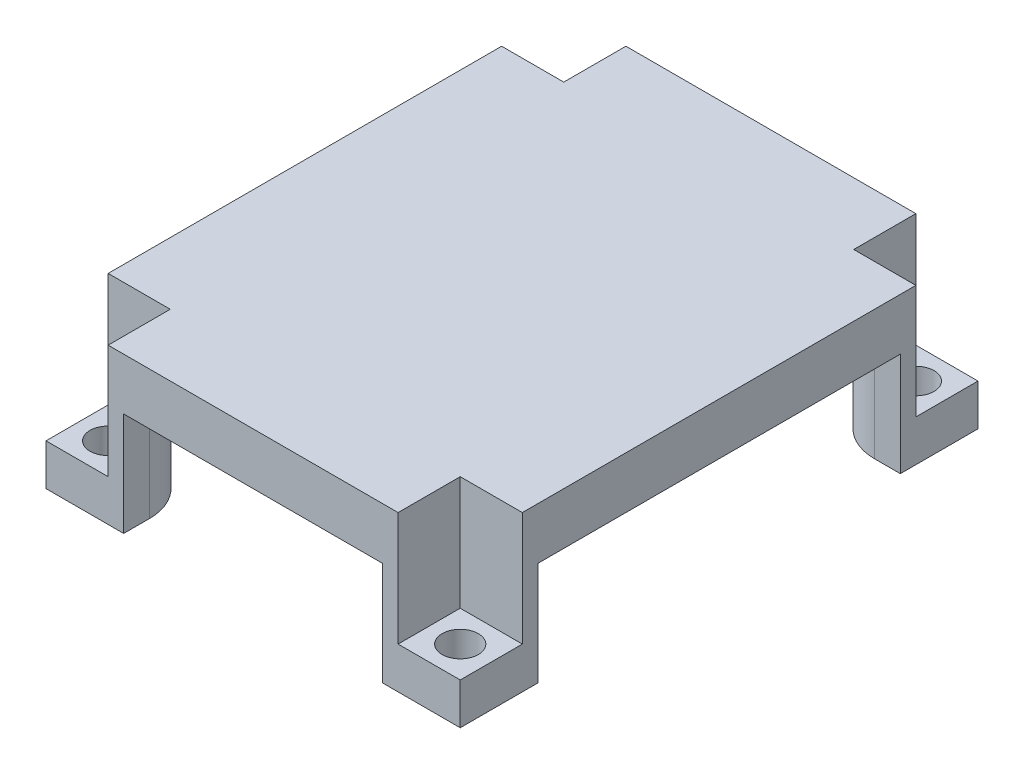
ISO-10303-21;
HEADER;
FILE_DESCRIPTION(('STEP AP214'),'2;1');
FILE_NAME('part.step','',(''),(''),'','','');
FILE_SCHEMA(('AUTOMOTIVE_DESIGN { 1 0 10303 214 1 1 1 1 }'));
ENDSEC;
DATA;
#1=APPLICATION_CONTEXT('core data for automotive mechanical design processes');
#2=APPLICATION_PROTOCOL_DEFINITION('international standard','automotive_design',2000,#1);
#3=PRODUCT_CONTEXT('',#1,'mechanical');
#4=PRODUCT('Part','Part','',(#3));
#5=PRODUCT_RELATED_PRODUCT_CATEGORY('part','',(#4));
#6=PRODUCT_DEFINITION_FORMATION('','',#4);
#7=PRODUCT_DEFINITION_CONTEXT('part definition',#1,'design');
#8=PRODUCT_DEFINITION('design','',#6,#7);
#9=PRODUCT_DEFINITION_SHAPE('','',#8);
#10=(LENGTH_UNIT() NAMED_UNIT(*) SI_UNIT(.MILLI.,.METRE.));
#11=(NAMED_UNIT(*) PLANE_ANGLE_UNIT() SI_UNIT($,.RADIAN.));
#12=(NAMED_UNIT(*) SI_UNIT($,.STERADIAN.) SOLID_ANGLE_UNIT());
#13=UNCERTAINTY_MEASURE_WITH_UNIT(LENGTH_MEASURE(1.E-05),#10,'distance_accuracy_value','');
#14=(GEOMETRIC_REPRESENTATION_CONTEXT(3) GLOBAL_UNCERTAINTY_ASSIGNED_CONTEXT((#13)) GLOBAL_UNIT_ASSIGNED_CONTEXT((#10,
#11,#12)) REPRESENTATION_CONTEXT('',''));
#15=CARTESIAN_POINT('',(0.,0.,0.));
#16=DIRECTION('',(0.,0.,1.));
#17=DIRECTION('',(1.,0.,0.));
#18=AXIS2_PLACEMENT_3D('',#15,#16,#17);
#19=CARTESIAN_POINT('',(0.,0.,0.));
#20=DIRECTION('',(0.,-1.,0.));
#21=DIRECTION('',(0.,0.,-1.));
#22=AXIS2_PLACEMENT_3D('',#19,#20,#21);
#23=PLANE('',#22);
#24=DIRECTION('',(0.,0.,1.));
#25=VECTOR('',#24,1.);
#26=CARTESIAN_POINT('',(-12.5,0.,-25.));
#27=LINE('',#26,#25);
#28=CARTESIAN_POINT('',(-12.5,0.,-25.));
#29=VERTEX_POINT('',#28);
#30=CARTESIAN_POINT('',(-12.5,0.,-22.5));
#31=VERTEX_POINT('',#30);
#32=EDGE_CURVE('E238',#29,#31,#27,.T.);
#33=ORIENTED_EDGE('',*,*,#32,.T.);
#34=CARTESIAN_POINT('',(-17.5,0.,-22.5));
#35=DIRECTION('',(0.,-1.,0.));
#36=DIRECTION('',(0.,0.,-1.));
#37=AXIS2_PLACEMENT_3D('',#34,#35,#36);
#38=CIRCLE('',#37,5.);
#39=CARTESIAN_POINT('',(-17.5,0.,-17.5));
#40=VERTEX_POINT('',#39);
#41=EDGE_CURVE('E337',#31,#40,#38,.T.);
#42=ORIENTED_EDGE('',*,*,#41,.T.);
#43=DIRECTION('',(-1.,0.,0.));
#44=VECTOR('',#43,1.);
#45=CARTESIAN_POINT('',(20.,0.,-17.5));
#46=LINE('',#45,#44);
#47=CARTESIAN_POINT('',(-20.,0.,-17.5));
#48=VERTEX_POINT('',#47);
#49=EDGE_CURVE('E392',#40,#48,#46,.T.);
#50=ORIENTED_EDGE('',*,*,#49,.T.);
#51=DIRECTION('',(0.,0.,1.));
#52=VECTOR('',#51,1.);
#53=CARTESIAN_POINT('',(-20.,0.,25.));
#54=LINE('',#53,#52);
#55=CARTESIAN_POINT('',(-20.,0.,-25.));
#56=VERTEX_POINT('',#55);
#57=EDGE_CURVE('E263',#56,#48,#54,.T.);
#58=ORIENTED_EDGE('',*,*,#57,.F.);
#59=DIRECTION('',(-1.,0.,0.));
#60=VECTOR('',#59,1.);
#61=CARTESIAN_POINT('',(-20.,0.,-25.));
#62=LINE('',#61,#60);
#63=EDGE_CURVE('E252',#29,#56,#62,.T.);
#64=ORIENTED_EDGE('',*,*,#63,.F.);
#65=EDGE_LOOP('',(#33,#42,#50,#58,#64));
#66=FACE_BOUND('',#65,.T.);
#67=CARTESIAN_POINT('',(-17.,0.,-22.));
#68=DIRECTION('',(0.,1.,0.));
#69=DIRECTION('',(0.,0.,1.));
#70=AXIS2_PLACEMENT_3D('',#67,#68,#69);
#71=CIRCLE('',#70,1.75);
#72=CARTESIAN_POINT('',(-17.,0.,-20.25));
#73=VERTEX_POINT('',#72);
#74=EDGE_CURVE('E502',#73,#73,#71,.T.);
#75=ORIENTED_EDGE('',*,*,#74,.T.);
#76=EDGE_LOOP('',(#75));
#77=FACE_BOUND('',#76,.T.);
#78=ADVANCED_FACE('F33',(#66,#77),#23,.T.);
#79=DIRECTION('',(-1.,0.,0.));
#80=VECTOR('',#79,1.);
#81=CARTESIAN_POINT('',(20.,0.,17.5));
#82=LINE('',#81,#80);
#83=CARTESIAN_POINT('',(-17.5,0.,17.5));
#84=VERTEX_POINT('',#83);
#85=CARTESIAN_POINT('',(-20.,0.,17.5));
#86=VERTEX_POINT('',#85);
#87=EDGE_CURVE('E372',#84,#86,#82,.T.);
#88=ORIENTED_EDGE('',*,*,#87,.F.);
#89=CARTESIAN_POINT('',(-17.5,0.,22.5));
#90=DIRECTION('',(0.,-1.,0.));
#91=DIRECTION('',(0.,0.,-1.));
#92=AXIS2_PLACEMENT_3D('',#89,#90,#91);
#93=CIRCLE('',#92,5.);
#94=CARTESIAN_POINT('',(-12.5,0.,22.5));
#95=VERTEX_POINT('',#94);
#96=EDGE_CURVE('E329',#84,#95,#93,.T.);
#97=ORIENTED_EDGE('',*,*,#96,.T.);
#98=CARTESIAN_POINT('',(-12.5,0.,25.));
#99=VERTEX_POINT('',#98);
#100=EDGE_CURVE('E247',#95,#99,#27,.T.);
#101=ORIENTED_EDGE('',*,*,#100,.T.);
#102=DIRECTION('',(1.,0.,0.));
#103=VECTOR('',#102,1.);
#104=CARTESIAN_POINT('',(-20.,0.,25.));
#105=LINE('',#104,#103);
#106=CARTESIAN_POINT('',(-20.,0.,25.));
#107=VERTEX_POINT('',#106);
#108=EDGE_CURVE('E276',#107,#99,#105,.T.);
#109=ORIENTED_EDGE('',*,*,#108,.F.);
#110=EDGE_CURVE('E268',#86,#107,#54,.T.);
#111=ORIENTED_EDGE('',*,*,#110,.F.);
#112=EDGE_LOOP('',(#88,#97,#101,#109,#111));
#113=FACE_BOUND('',#112,.T.);
#114=CARTESIAN_POINT('',(-17.,0.,22.));
#115=DIRECTION('',(0.,-1.,0.));
#116=DIRECTION('',(0.,0.,-1.));
#117=AXIS2_PLACEMENT_3D('',#114,#115,#116);
#118=CIRCLE('',#117,1.75);
#119=CARTESIAN_POINT('',(-17.,0.,20.25));
#120=VERTEX_POINT('',#119);
#121=EDGE_CURVE('E296',#120,#120,#118,.T.);
#122=ORIENTED_EDGE('',*,*,#121,.F.);
#123=EDGE_LOOP('',(#122));
#124=FACE_BOUND('',#123,.T.);
#125=ADVANCED_FACE('F367',(#113,#124),#23,.T.);
#126=CARTESIAN_POINT('',(20.,0.,-17.5));
#127=DIRECTION('',(0.,0.,-1.));
#128=DIRECTION('',(0.,1.,0.));
#129=AXIS2_PLACEMENT_3D('',#126,#127,#128);
#130=PLANE('',#129);
#131=ORIENTED_EDGE('',*,*,#49,.F.);
#132=DIRECTION('',(0.,1.,0.));
#133=VECTOR('',#132,1.);
#134=CARTESIAN_POINT('',(-17.5,0.,-17.5));
#135=LINE('',#134,#133);
#136=CARTESIAN_POINT('',(-17.5,10.,-17.5));
#137=VERTEX_POINT('',#136);
#138=EDGE_CURVE('E333',#40,#137,#135,.T.);
#139=ORIENTED_EDGE('',*,*,#138,.T.);
#140=DIRECTION('',(-1.,0.,0.));
#141=VECTOR('',#140,1.);
#142=CARTESIAN_POINT('',(20.,10.,-17.5));
#143=LINE('',#142,#141);
#144=CARTESIAN_POINT('',(-20.,10.,-17.5));
#145=VERTEX_POINT('',#144);
#146=EDGE_CURVE('E402',#137,#145,#143,.T.);
#147=ORIENTED_EDGE('',*,*,#146,.T.);
#148=DIRECTION('',(0.,-1.,0.));
#149=VECTOR('',#148,1.);
#150=CARTESIAN_POINT('',(-20.,0.,-17.5));
#151=LINE('',#150,#149);
#152=EDGE_CURVE('E393',#145,#48,#151,.T.);
#153=ORIENTED_EDGE('',*,*,#152,.T.);
#154=EDGE_LOOP('',(#131,#139,#147,#153));
#155=FACE_BOUND('',#154,.T.);
#156=ADVANCED_FACE('F596',(#155),#130,.F.);
#157=CARTESIAN_POINT('',(20.,0.,17.5));
#158=DIRECTION('',(0.,0.,1.));
#159=DIRECTION('',(0.,-1.,0.));
#160=AXIS2_PLACEMENT_3D('',#157,#158,#159);
#161=PLANE('',#160);
#162=DIRECTION('',(-1.,0.,0.));
#163=VECTOR('',#162,1.);
#164=CARTESIAN_POINT('',(20.,10.,17.5));
#165=LINE('',#164,#163);
#166=CARTESIAN_POINT('',(-17.5,10.,17.5));
#167=VERTEX_POINT('',#166);
#168=CARTESIAN_POINT('',(-20.,10.,17.5));
#169=VERTEX_POINT('',#168);
#170=EDGE_CURVE('E348',#167,#169,#165,.T.);
#171=ORIENTED_EDGE('',*,*,#170,.F.);
#172=DIRECTION('',(0.,-1.,0.));
#173=VECTOR('',#172,1.);
#174=CARTESIAN_POINT('',(-17.5,0.,17.5));
#175=LINE('',#174,#173);
#176=EDGE_CURVE('E326',#167,#84,#175,.T.);
#177=ORIENTED_EDGE('',*,*,#176,.T.);
#178=ORIENTED_EDGE('',*,*,#87,.T.);
#179=DIRECTION('',(0.,1.,0.));
#180=VECTOR('',#179,1.);
#181=CARTESIAN_POINT('',(-20.,0.,17.5));
#182=LINE('',#181,#180);
#183=EDGE_CURVE('E359',#86,#169,#182,.T.);
#184=ORIENTED_EDGE('',*,*,#183,.T.);
#185=EDGE_LOOP('',(#171,#177,#178,#184));
#186=FACE_BOUND('',#185,.T.);
#187=ADVANCED_FACE('F356',(#186),#161,.F.);
#188=CARTESIAN_POINT('',(20.,0.,-17.5));
#189=VERTEX_POINT('',#188);
#190=CARTESIAN_POINT('',(17.5,0.,-17.5));
#191=VERTEX_POINT('',#190);
#192=EDGE_CURVE('E406',#189,#191,#46,.T.);
#193=ORIENTED_EDGE('',*,*,#192,.T.);
#194=CARTESIAN_POINT('',(17.5,0.,-22.5));
#195=DIRECTION('',(0.,-1.,0.));
#196=DIRECTION('',(0.,0.,-1.));
#197=AXIS2_PLACEMENT_3D('',#194,#195,#196);
#198=CIRCLE('',#197,5.);
#199=CARTESIAN_POINT('',(12.5,0.,-22.5));
#200=VERTEX_POINT('',#199);
#201=EDGE_CURVE('E315',#191,#200,#198,.T.);
#202=ORIENTED_EDGE('',*,*,#201,.T.);
#203=DIRECTION('',(0.,0.,1.));
#204=VECTOR('',#203,1.);
#205=CARTESIAN_POINT('',(12.5,0.,-25.));
#206=LINE('',#205,#204);
#207=CARTESIAN_POINT('',(12.5,0.,-25.));
#208=VERTEX_POINT('',#207);
#209=EDGE_CURVE('E380',#208,#200,#206,.T.);
#210=ORIENTED_EDGE('',*,*,#209,.F.);
#211=CARTESIAN_POINT('',(20.,0.,-25.));
#212=VERTEX_POINT('',#211);
#213=EDGE_CURVE('E264',#212,#208,#62,.T.);
#214=ORIENTED_EDGE('',*,*,#213,.F.);
#215=DIRECTION('',(0.,0.,-1.));
#216=VECTOR('',#215,1.);
#217=CARTESIAN_POINT('',(20.,0.,25.));
#218=LINE('',#217,#216);
#219=EDGE_CURVE('E270',#189,#212,#218,.T.);
#220=ORIENTED_EDGE('',*,*,#219,.F.);
#221=EDGE_LOOP('',(#193,#202,#210,#214,#220));
#222=FACE_BOUND('',#221,.T.);
#223=CARTESIAN_POINT('',(17.,0.,-22.));
#224=DIRECTION('',(0.,-1.,0.));
#225=DIRECTION('',(0.,0.,1.));
#226=AXIS2_PLACEMENT_3D('',#223,#224,#225);
#227=CIRCLE('',#226,1.75);
#228=CARTESIAN_POINT('',(17.,0.,-20.25));
#229=VERTEX_POINT('',#228);
#230=EDGE_CURVE('E499',#229,#229,#227,.T.);
#231=ORIENTED_EDGE('',*,*,#230,.F.);
#232=EDGE_LOOP('',(#231));
#233=FACE_BOUND('',#232,.T.);
#234=ADVANCED_FACE('F597',(#222,#233),#23,.T.);
#235=CARTESIAN_POINT('',(0.,15.,0.));
#236=DIRECTION('',(0.,-1.,0.));
#237=DIRECTION('',(0.,0.,-1.));
#238=AXIS2_PLACEMENT_3D('',#235,#236,#237);
#239=PLANE('',#238);
#240=DIRECTION('',(1.,0.,0.));
#241=VECTOR('',#240,1.);
#242=CARTESIAN_POINT('',(-14.,15.,19.));
#243=LINE('',#242,#241);
#244=CARTESIAN_POINT('',(-20.,15.,19.));
#245=VERTEX_POINT('',#244);
#246=CARTESIAN_POINT('',(-14.,15.,19.));
#247=VERTEX_POINT('',#246);
#248=EDGE_CURVE('E413',#245,#247,#243,.T.);
#249=ORIENTED_EDGE('',*,*,#248,.T.);
#250=DIRECTION('',(0.,0.,1.));
#251=VECTOR('',#250,1.);
#252=CARTESIAN_POINT('',(-14.,15.,19.));
#253=LINE('',#252,#251);
#254=CARTESIAN_POINT('',(-14.,15.,25.));
#255=VERTEX_POINT('',#254);
#256=EDGE_CURVE('E401',#247,#255,#253,.T.);
#257=ORIENTED_EDGE('',*,*,#256,.T.);
#258=DIRECTION('',(1.,0.,0.));
#259=VECTOR('',#258,1.);
#260=CARTESIAN_POINT('',(-20.,15.,25.));
#261=LINE('',#260,#259);
#262=CARTESIAN_POINT('',(14.,15.,25.));
#263=VERTEX_POINT('',#262);
#264=EDGE_CURVE('E284',#255,#263,#261,.T.);
#265=ORIENTED_EDGE('',*,*,#264,.T.);
#266=DIRECTION('',(0.,0.,1.));
#267=VECTOR('',#266,1.);
#268=CARTESIAN_POINT('',(14.,15.,19.));
#269=LINE('',#268,#267);
#270=CARTESIAN_POINT('',(14.,15.,19.));
#271=VERTEX_POINT('',#270);
#272=EDGE_CURVE('E434',#271,#263,#269,.T.);
#273=ORIENTED_EDGE('',*,*,#272,.F.);
#274=DIRECTION('',(-1.,0.,0.));
#275=VECTOR('',#274,1.);
#276=CARTESIAN_POINT('',(14.,15.,19.));
#277=LINE('',#276,#275);
#278=CARTESIAN_POINT('',(20.,15.,19.));
#279=VERTEX_POINT('',#278);
#280=EDGE_CURVE('E311',#279,#271,#277,.T.);
#281=ORIENTED_EDGE('',*,*,#280,.F.);
#282=DIRECTION('',(0.,0.,-1.));
#283=VECTOR('',#282,1.);
#284=CARTESIAN_POINT('',(20.,15.,25.));
#285=LINE('',#284,#283);
#286=CARTESIAN_POINT('',(20.,15.,-19.));
#287=VERTEX_POINT('',#286);
#288=EDGE_CURVE('E279',#279,#287,#285,.T.);
#289=ORIENTED_EDGE('',*,*,#288,.T.);
#290=DIRECTION('',(-1.,0.,0.));
#291=VECTOR('',#290,1.);
#292=CARTESIAN_POINT('',(14.,15.,-19.));
#293=LINE('',#292,#291);
#294=CARTESIAN_POINT('',(14.,15.,-19.));
#295=VERTEX_POINT('',#294);
#296=EDGE_CURVE('E455',#287,#295,#293,.T.);
#297=ORIENTED_EDGE('',*,*,#296,.T.);
#298=DIRECTION('',(0.,0.,-1.));
#299=VECTOR('',#298,1.);
#300=CARTESIAN_POINT('',(14.,15.,-19.));
#301=LINE('',#300,#299);
#302=CARTESIAN_POINT('',(14.,15.,-25.));
#303=VERTEX_POINT('',#302);
#304=EDGE_CURVE('E306',#295,#303,#301,.T.);
#305=ORIENTED_EDGE('',*,*,#304,.T.);
#306=DIRECTION('',(-1.,0.,0.));
#307=VECTOR('',#306,1.);
#308=CARTESIAN_POINT('',(-20.,15.,-25.));
#309=LINE('',#308,#307);
#310=CARTESIAN_POINT('',(-14.,15.,-25.));
#311=VERTEX_POINT('',#310);
#312=EDGE_CURVE('E506',#303,#311,#309,.T.);
#313=ORIENTED_EDGE('',*,*,#312,.T.);
#314=DIRECTION('',(0.,0.,-1.));
#315=VECTOR('',#314,1.);
#316=CARTESIAN_POINT('',(-14.,15.,-19.));
#317=LINE('',#316,#315);
#318=CARTESIAN_POINT('',(-14.,15.,-19.));
#319=VERTEX_POINT('',#318);
#320=EDGE_CURVE('E476',#319,#311,#317,.T.);
#321=ORIENTED_EDGE('',*,*,#320,.F.);
#322=DIRECTION('',(1.,0.,0.));
#323=VECTOR('',#322,1.);
#324=CARTESIAN_POINT('',(-14.,15.,-19.));
#325=LINE('',#324,#323);
#326=CARTESIAN_POINT('',(-20.,15.,-19.));
#327=VERTEX_POINT('',#326);
#328=EDGE_CURVE('E301',#327,#319,#325,.T.);
#329=ORIENTED_EDGE('',*,*,#328,.F.);
#330=DIRECTION('',(0.,0.,1.));
#331=VECTOR('',#330,1.);
#332=CARTESIAN_POINT('',(-20.,15.,25.));
#333=LINE('',#332,#331);
#334=EDGE_CURVE('E508',#327,#245,#333,.T.);
#335=ORIENTED_EDGE('',*,*,#334,.T.);
#336=EDGE_LOOP('',(#249,#257,#265,#273,#281,#289,#297,#305,#313,#321,#329,#335));
#337=FACE_BOUND('',#336,.T.);
#338=ADVANCED_FACE('F513',(#337),#239,.F.);
#339=CARTESIAN_POINT('',(-20.,15.,25.));
#340=DIRECTION('',(1.,0.,0.));
#341=DIRECTION('',(0.,0.,-1.));
#342=AXIS2_PLACEMENT_3D('',#339,#340,#341);
#343=PLANE('',#342);
#344=ORIENTED_EDGE('',*,*,#57,.T.);
#345=ORIENTED_EDGE('',*,*,#152,.F.);
#346=DIRECTION('',(0.,0.,-1.));
#347=VECTOR('',#346,1.);
#348=CARTESIAN_POINT('',(-20.,10.,-17.5));
#349=LINE('',#348,#347);
#350=EDGE_CURVE('E386',#169,#145,#349,.T.);
#351=ORIENTED_EDGE('',*,*,#350,.F.);
#352=ORIENTED_EDGE('',*,*,#183,.F.);
#353=ORIENTED_EDGE('',*,*,#110,.T.);
#354=DIRECTION('',(0.,-1.,0.));
#355=VECTOR('',#354,1.);
#356=CARTESIAN_POINT('',(-20.,15.,25.));
#357=LINE('',#356,#355);
#358=CARTESIAN_POINT('',(-20.,4.,25.));
#359=VERTEX_POINT('',#358);
#360=EDGE_CURVE('E283',#359,#107,#357,.T.);
#361=ORIENTED_EDGE('',*,*,#360,.F.);
#362=DIRECTION('',(0.,0.,-1.));
#363=VECTOR('',#362,1.);
#364=CARTESIAN_POINT('',(-20.,4.,19.));
#365=LINE('',#364,#363);
#366=CARTESIAN_POINT('',(-20.,4.,19.));
#367=VERTEX_POINT('',#366);
#368=EDGE_CURVE('E409',#359,#367,#365,.T.);
#369=ORIENTED_EDGE('',*,*,#368,.T.);
#370=DIRECTION('',(0.,1.,0.));
#371=VECTOR('',#370,1.);
#372=CARTESIAN_POINT('',(-20.,4.,19.));
#373=LINE('',#372,#371);
#374=EDGE_CURVE('E312',#367,#245,#373,.T.);
#375=ORIENTED_EDGE('',*,*,#374,.T.);
#376=ORIENTED_EDGE('',*,*,#334,.F.);
#377=DIRECTION('',(0.,1.,0.));
#378=VECTOR('',#377,1.);
#379=CARTESIAN_POINT('',(-20.,4.,-19.));
#380=LINE('',#379,#378);
#381=CARTESIAN_POINT('',(-20.,4.,-19.));
#382=VERTEX_POINT('',#381);
#383=EDGE_CURVE('E484',#382,#327,#380,.T.);
#384=ORIENTED_EDGE('',*,*,#383,.F.);
#385=DIRECTION('',(0.,0.,1.));
#386=VECTOR('',#385,1.);
#387=CARTESIAN_POINT('',(-20.,4.,-19.));
#388=LINE('',#387,#386);
#389=CARTESIAN_POINT('',(-20.,4.,-25.));
#390=VERTEX_POINT('',#389);
#391=EDGE_CURVE('E472',#390,#382,#388,.T.);
#392=ORIENTED_EDGE('',*,*,#391,.F.);
#393=DIRECTION('',(0.,-1.,0.));
#394=VECTOR('',#393,1.);
#395=CARTESIAN_POINT('',(-20.,15.,-25.));
#396=LINE('',#395,#394);
#397=EDGE_CURVE('E287',#390,#56,#396,.T.);
#398=ORIENTED_EDGE('',*,*,#397,.T.);
#399=EDGE_LOOP('',(#344,#345,#351,#352,#353,#361,#369,#375,#376,#384,#392,#398));
#400=FACE_BOUND('',#399,.T.);
#401=ADVANCED_FACE('F564',(#400),#343,.F.);
#402=CARTESIAN_POINT('',(-20.,15.,25.));
#403=DIRECTION('',(0.,0.,-1.));
#404=DIRECTION('',(-1.,0.,0.));
#405=AXIS2_PLACEMENT_3D('',#402,#403,#404);
#406=PLANE('',#405);
#407=ORIENTED_EDGE('',*,*,#108,.T.);
#408=DIRECTION('',(0.,-1.,0.));
#409=VECTOR('',#408,1.);
#410=CARTESIAN_POINT('',(-12.5,0.,25.));
#411=LINE('',#410,#409);
#412=CARTESIAN_POINT('',(-12.5,10.,25.));
#413=VERTEX_POINT('',#412);
#414=EDGE_CURVE('E376',#413,#99,#411,.T.);
#415=ORIENTED_EDGE('',*,*,#414,.F.);
#416=DIRECTION('',(-1.,0.,0.));
#417=VECTOR('',#416,1.);
#418=CARTESIAN_POINT('',(-12.5,10.,25.));
#419=LINE('',#418,#417);
#420=CARTESIAN_POINT('',(12.5,10.,25.));
#421=VERTEX_POINT('',#420);
#422=EDGE_CURVE('E258',#421,#413,#419,.T.);
#423=ORIENTED_EDGE('',*,*,#422,.F.);
#424=DIRECTION('',(0.,1.,0.));
#425=VECTOR('',#424,1.);
#426=CARTESIAN_POINT('',(12.5,0.,25.));
#427=LINE('',#426,#425);
#428=CARTESIAN_POINT('',(12.5,0.,25.));
#429=VERTEX_POINT('',#428);
#430=EDGE_CURVE('E687',#429,#421,#427,.T.);
#431=ORIENTED_EDGE('',*,*,#430,.F.);
#432=CARTESIAN_POINT('',(20.,0.,25.));
#433=VERTEX_POINT('',#432);
#434=EDGE_CURVE('E275',#429,#433,#105,.T.);
#435=ORIENTED_EDGE('',*,*,#434,.T.);
#436=DIRECTION('',(0.,-1.,0.));
#437=VECTOR('',#436,1.);
#438=CARTESIAN_POINT('',(20.,15.,25.));
#439=LINE('',#438,#437);
#440=CARTESIAN_POINT('',(20.,4.,25.));
#441=VERTEX_POINT('',#440);
#442=EDGE_CURVE('E280',#441,#433,#439,.T.);
#443=ORIENTED_EDGE('',*,*,#442,.F.);
#444=DIRECTION('',(1.,0.,0.));
#445=VECTOR('',#444,1.);
#446=CARTESIAN_POINT('',(14.,4.,25.));
#447=LINE('',#446,#445);
#448=CARTESIAN_POINT('',(14.,4.,25.));
#449=VERTEX_POINT('',#448);
#450=EDGE_CURVE('E439',#449,#441,#447,.T.);
#451=ORIENTED_EDGE('',*,*,#450,.F.);
#452=DIRECTION('',(0.,1.,0.));
#453=VECTOR('',#452,1.);
#454=CARTESIAN_POINT('',(14.,4.,25.));
#455=LINE('',#454,#453);
#456=EDGE_CURVE('E307',#449,#263,#455,.T.);
#457=ORIENTED_EDGE('',*,*,#456,.T.);
#458=ORIENTED_EDGE('',*,*,#264,.F.);
#459=DIRECTION('',(0.,1.,0.));
#460=VECTOR('',#459,1.);
#461=CARTESIAN_POINT('',(-14.,4.,25.));
#462=LINE('',#461,#460);
#463=CARTESIAN_POINT('',(-14.,4.,25.));
#464=VERTEX_POINT('',#463);
#465=EDGE_CURVE('E420',#464,#255,#462,.T.);
#466=ORIENTED_EDGE('',*,*,#465,.F.);
#467=DIRECTION('',(-1.,0.,0.));
#468=VECTOR('',#467,1.);
#469=CARTESIAN_POINT('',(-14.,4.,25.));
#470=LINE('',#469,#468);
#471=EDGE_CURVE('E412',#464,#359,#470,.T.);
#472=ORIENTED_EDGE('',*,*,#471,.T.);
#473=ORIENTED_EDGE('',*,*,#360,.T.);
#474=EDGE_LOOP('',(#407,#415,#423,#431,#435,#443,#451,#457,#458,#466,#472,#473));
#475=FACE_BOUND('',#474,.T.);
#476=ADVANCED_FACE('F523',(#475),#406,.F.);
#477=CARTESIAN_POINT('',(-17.,0.,22.));
#478=DIRECTION('',(0.,1.,0.));
#479=DIRECTION('',(0.,0.,1.));
#480=AXIS2_PLACEMENT_3D('',#477,#478,#479);
#481=CYLINDRICAL_SURFACE('',#480,1.75);
#482=ORIENTED_EDGE('',*,*,#121,.T.);
#483=EDGE_LOOP('',(#482));
#484=FACE_BOUND('',#483,.T.);
#485=CARTESIAN_POINT('',(-17.,4.,22.));
#486=DIRECTION('',(0.,1.,0.));
#487=DIRECTION('',(0.,0.,1.));
#488=AXIS2_PLACEMENT_3D('',#485,#486,#487);
#489=CIRCLE('',#488,1.75);
#490=CARTESIAN_POINT('',(-17.,4.,23.75));
#491=VERTEX_POINT('',#490);
#492=EDGE_CURVE('E308',#491,#491,#489,.T.);
#493=ORIENTED_EDGE('',*,*,#492,.T.);
#494=EDGE_LOOP('',(#493));
#495=FACE_BOUND('',#494,.T.);
#496=ADVANCED_FACE('F646',(#484,#495),#481,.F.);
#497=CARTESIAN_POINT('',(17.,0.,22.));
#498=DIRECTION('',(0.,1.,0.));
#499=DIRECTION('',(0.,0.,1.));
#500=AXIS2_PLACEMENT_3D('',#497,#498,#499);
#501=CYLINDRICAL_SURFACE('',#500,1.75);
#502=CARTESIAN_POINT('',(17.,0.,22.));
#503=DIRECTION('',(0.,1.,0.));
#504=DIRECTION('',(0.,0.,-1.));
#505=AXIS2_PLACEMENT_3D('',#502,#503,#504);
#506=CIRCLE('',#505,1.75);
#507=CARTESIAN_POINT('',(17.,0.,20.25));
#508=VERTEX_POINT('',#507);
#509=EDGE_CURVE('E496',#508,#508,#506,.T.);
#510=ORIENTED_EDGE('',*,*,#509,.F.);
#511=EDGE_LOOP('',(#510));
#512=FACE_BOUND('',#511,.T.);
#513=CARTESIAN_POINT('',(17.,4.,22.));
#514=DIRECTION('',(0.,1.,0.));
#515=DIRECTION('',(0.,0.,1.));
#516=AXIS2_PLACEMENT_3D('',#513,#514,#515);
#517=CIRCLE('',#516,1.75);
#518=CARTESIAN_POINT('',(17.,4.,23.75));
#519=VERTEX_POINT('',#518);
#520=EDGE_CURVE('E303',#519,#519,#517,.F.);
#521=ORIENTED_EDGE('',*,*,#520,.F.);
#522=EDGE_LOOP('',(#521));
#523=FACE_BOUND('',#522,.T.);
#524=ADVANCED_FACE('F649',(#512,#523),#501,.F.);
#525=CARTESIAN_POINT('',(20.,15.,25.));
#526=DIRECTION('',(-1.,0.,0.));
#527=DIRECTION('',(0.,0.,1.));
#528=AXIS2_PLACEMENT_3D('',#525,#526,#527);
#529=PLANE('',#528);
#530=DIRECTION('',(0.,0.,-1.));
#531=VECTOR('',#530,1.);
#532=CARTESIAN_POINT('',(20.,10.,-17.5));
#533=LINE('',#532,#531);
#534=CARTESIAN_POINT('',(20.,10.,17.5));
#535=VERTEX_POINT('',#534);
#536=CARTESIAN_POINT('',(20.,10.,-17.5));
#537=VERTEX_POINT('',#536);
#538=EDGE_CURVE('E389',#535,#537,#533,.T.);
#539=ORIENTED_EDGE('',*,*,#538,.T.);
#540=DIRECTION('',(0.,-1.,0.));
#541=VECTOR('',#540,1.);
#542=CARTESIAN_POINT('',(20.,0.,-17.5));
#543=LINE('',#542,#541);
#544=EDGE_CURVE('E382',#537,#189,#543,.T.);
#545=ORIENTED_EDGE('',*,*,#544,.T.);
#546=ORIENTED_EDGE('',*,*,#219,.T.);
#547=DIRECTION('',(0.,-1.,0.));
#548=VECTOR('',#547,1.);
#549=CARTESIAN_POINT('',(20.,15.,-25.));
#550=LINE('',#549,#548);
#551=CARTESIAN_POINT('',(20.,4.,-25.));
#552=VERTEX_POINT('',#551);
#553=EDGE_CURVE('E289',#552,#212,#550,.T.);
#554=ORIENTED_EDGE('',*,*,#553,.F.);
#555=DIRECTION('',(0.,0.,1.));
#556=VECTOR('',#555,1.);
#557=CARTESIAN_POINT('',(20.,4.,-19.));
#558=LINE('',#557,#556);
#559=CARTESIAN_POINT('',(20.,4.,-19.));
#560=VERTEX_POINT('',#559);
#561=EDGE_CURVE('E451',#552,#560,#558,.T.);
#562=ORIENTED_EDGE('',*,*,#561,.T.);
#563=DIRECTION('',(0.,1.,0.));
#564=VECTOR('',#563,1.);
#565=CARTESIAN_POINT('',(20.,4.,-19.));
#566=LINE('',#565,#564);
#567=EDGE_CURVE('E302',#560,#287,#566,.T.);
#568=ORIENTED_EDGE('',*,*,#567,.T.);
#569=ORIENTED_EDGE('',*,*,#288,.F.);
#570=DIRECTION('',(0.,1.,0.));
#571=VECTOR('',#570,1.);
#572=CARTESIAN_POINT('',(20.,4.,19.));
#573=LINE('',#572,#571);
#574=CARTESIAN_POINT('',(20.,4.,19.));
#575=VERTEX_POINT('',#574);
#576=EDGE_CURVE('E441',#575,#279,#573,.T.);
#577=ORIENTED_EDGE('',*,*,#576,.F.);
#578=DIRECTION('',(0.,0.,-1.));
#579=VECTOR('',#578,1.);
#580=CARTESIAN_POINT('',(20.,4.,19.));
#581=LINE('',#580,#579);
#582=EDGE_CURVE('E430',#441,#575,#581,.T.);
#583=ORIENTED_EDGE('',*,*,#582,.F.);
#584=ORIENTED_EDGE('',*,*,#442,.T.);
#585=CARTESIAN_POINT('',(20.,0.,17.5));
#586=VERTEX_POINT('',#585);
#587=EDGE_CURVE('E265',#433,#586,#218,.T.);
#588=ORIENTED_EDGE('',*,*,#587,.T.);
#589=DIRECTION('',(0.,1.,0.));
#590=VECTOR('',#589,1.);
#591=CARTESIAN_POINT('',(20.,0.,17.5));
#592=LINE('',#591,#590);
#593=EDGE_CURVE('E385',#586,#535,#592,.T.);
#594=ORIENTED_EDGE('',*,*,#593,.T.);
#595=EDGE_LOOP('',(#539,#545,#546,#554,#562,#568,#569,#577,#583,#584,#588,#594));
#596=FACE_BOUND('',#595,.T.);
#597=ADVANCED_FACE('F531',(#596),#529,.F.);
#598=CARTESIAN_POINT('',(-20.,15.,-25.));
#599=DIRECTION('',(0.,0.,1.));
#600=DIRECTION('',(1.,0.,0.));
#601=AXIS2_PLACEMENT_3D('',#598,#599,#600);
#602=PLANE('',#601);
#603=DIRECTION('',(-1.,0.,0.));
#604=VECTOR('',#603,1.);
#605=CARTESIAN_POINT('',(-12.5,10.,-25.));
#606=LINE('',#605,#604);
#607=CARTESIAN_POINT('',(12.5,10.,-25.));
#608=VERTEX_POINT('',#607);
#609=CARTESIAN_POINT('',(-12.5,10.,-25.));
#610=VERTEX_POINT('',#609);
#611=EDGE_CURVE('E256',#608,#610,#606,.T.);
#612=ORIENTED_EDGE('',*,*,#611,.T.);
#613=DIRECTION('',(0.,-1.,0.));
#614=VECTOR('',#613,1.);
#615=CARTESIAN_POINT('',(-12.5,0.,-25.));
#616=LINE('',#615,#614);
#617=EDGE_CURVE('E241',#610,#29,#616,.T.);
#618=ORIENTED_EDGE('',*,*,#617,.T.);
#619=ORIENTED_EDGE('',*,*,#63,.T.);
#620=ORIENTED_EDGE('',*,*,#397,.F.);
#621=DIRECTION('',(-1.,0.,0.));
#622=VECTOR('',#621,1.);
#623=CARTESIAN_POINT('',(-14.,4.,-25.));
#624=LINE('',#623,#622);
#625=CARTESIAN_POINT('',(-14.,4.,-25.));
#626=VERTEX_POINT('',#625);
#627=EDGE_CURVE('E482',#626,#390,#624,.T.);
#628=ORIENTED_EDGE('',*,*,#627,.F.);
#629=DIRECTION('',(0.,1.,0.));
#630=VECTOR('',#629,1.);
#631=CARTESIAN_POINT('',(-14.,4.,-25.));
#632=LINE('',#631,#630);
#633=EDGE_CURVE('E297',#626,#311,#632,.T.);
#634=ORIENTED_EDGE('',*,*,#633,.T.);
#635=ORIENTED_EDGE('',*,*,#312,.F.);
#636=DIRECTION('',(0.,1.,0.));
#637=VECTOR('',#636,1.);
#638=CARTESIAN_POINT('',(14.,4.,-25.));
#639=LINE('',#638,#637);
#640=CARTESIAN_POINT('',(14.,4.,-25.));
#641=VERTEX_POINT('',#640);
#642=EDGE_CURVE('E462',#641,#303,#639,.T.);
#643=ORIENTED_EDGE('',*,*,#642,.F.);
#644=DIRECTION('',(1.,0.,0.));
#645=VECTOR('',#644,1.);
#646=CARTESIAN_POINT('',(14.,4.,-25.));
#647=LINE('',#646,#645);
#648=EDGE_CURVE('E454',#641,#552,#647,.T.);
#649=ORIENTED_EDGE('',*,*,#648,.T.);
#650=ORIENTED_EDGE('',*,*,#553,.T.);
#651=ORIENTED_EDGE('',*,*,#213,.T.);
#652=DIRECTION('',(0.,1.,0.));
#653=VECTOR('',#652,1.);
#654=CARTESIAN_POINT('',(12.5,0.,-25.));
#655=LINE('',#654,#653);
#656=EDGE_CURVE('E257',#208,#608,#655,.T.);
#657=ORIENTED_EDGE('',*,*,#656,.T.);
#658=EDGE_LOOP('',(#612,#618,#619,#620,#628,#634,#635,#643,#649,#650,#651,#657));
#659=FACE_BOUND('',#658,.T.);
#660=ADVANCED_FACE('F250',(#659),#602,.F.);
#661=CARTESIAN_POINT('',(17.,0.,-22.));
#662=DIRECTION('',(0.,1.,0.));
#663=DIRECTION('',(0.,0.,1.));
#664=AXIS2_PLACEMENT_3D('',#661,#662,#663);
#665=CYLINDRICAL_SURFACE('',#664,1.75);
#666=ORIENTED_EDGE('',*,*,#230,.T.);
#667=EDGE_LOOP('',(#666));
#668=FACE_BOUND('',#667,.T.);
#669=CARTESIAN_POINT('',(17.,4.,-22.));
#670=DIRECTION('',(0.,1.,0.));
#671=DIRECTION('',(0.,0.,1.));
#672=AXIS2_PLACEMENT_3D('',#669,#670,#671);
#673=CIRCLE('',#672,1.75);
#674=CARTESIAN_POINT('',(17.,4.,-20.25));
#675=VERTEX_POINT('',#674);
#676=EDGE_CURVE('E298',#675,#675,#673,.T.);
#677=ORIENTED_EDGE('',*,*,#676,.T.);
#678=EDGE_LOOP('',(#677));
#679=FACE_BOUND('',#678,.T.);
#680=ADVANCED_FACE('F608',(#668,#679),#665,.F.);
#681=CARTESIAN_POINT('',(-17.,0.,-22.));
#682=DIRECTION('',(0.,1.,0.));
#683=DIRECTION('',(0.,0.,1.));
#684=AXIS2_PLACEMENT_3D('',#681,#682,#683);
#685=CYLINDRICAL_SURFACE('',#684,1.75);
#686=ORIENTED_EDGE('',*,*,#74,.F.);
#687=EDGE_LOOP('',(#686));
#688=FACE_BOUND('',#687,.T.);
#689=CARTESIAN_POINT('',(-17.,4.,-22.));
#690=DIRECTION('',(0.,1.,0.));
#691=DIRECTION('',(0.,0.,1.));
#692=AXIS2_PLACEMENT_3D('',#689,#690,#691);
#693=CIRCLE('',#692,1.75);
#694=CARTESIAN_POINT('',(-17.,4.,-20.25));
#695=VERTEX_POINT('',#694);
#696=EDGE_CURVE('E293',#695,#695,#693,.F.);
#697=ORIENTED_EDGE('',*,*,#696,.F.);
#698=EDGE_LOOP('',(#697));
#699=FACE_BOUND('',#698,.T.);
#700=ADVANCED_FACE('F601',(#688,#699),#685,.F.);
#701=CARTESIAN_POINT('',(12.5,0.,22.5));
#702=VERTEX_POINT('',#701);
#703=EDGE_CURVE('E246',#702,#429,#206,.T.);
#704=ORIENTED_EDGE('',*,*,#703,.F.);
#705=CARTESIAN_POINT('',(17.5,0.,22.5));
#706=DIRECTION('',(0.,-1.,0.));
#707=DIRECTION('',(0.,0.,-1.));
#708=AXIS2_PLACEMENT_3D('',#705,#706,#707);
#709=CIRCLE('',#708,5.);
#710=CARTESIAN_POINT('',(17.5,0.,17.5));
#711=VERTEX_POINT('',#710);
#712=EDGE_CURVE('E324',#702,#711,#709,.T.);
#713=ORIENTED_EDGE('',*,*,#712,.T.);
#714=EDGE_CURVE('E362',#586,#711,#82,.T.);
#715=ORIENTED_EDGE('',*,*,#714,.F.);
#716=ORIENTED_EDGE('',*,*,#587,.F.);
#717=ORIENTED_EDGE('',*,*,#434,.F.);
#718=EDGE_LOOP('',(#704,#713,#715,#716,#717));
#719=FACE_BOUND('',#718,.T.);
#720=ORIENTED_EDGE('',*,*,#509,.T.);
#721=EDGE_LOOP('',(#720));
#722=FACE_BOUND('',#721,.T.);
#723=ADVANCED_FACE('F592',(#719,#722),#23,.T.);
#724=CARTESIAN_POINT('',(0.,4.,0.));
#725=DIRECTION('',(0.,1.,0.));
#726=DIRECTION('',(0.,0.,1.));
#727=AXIS2_PLACEMENT_3D('',#724,#725,#726);
#728=PLANE('',#727);
#729=ORIENTED_EDGE('',*,*,#391,.T.);
#730=DIRECTION('',(1.,0.,0.));
#731=VECTOR('',#730,1.);
#732=CARTESIAN_POINT('',(-14.,4.,-19.));
#733=LINE('',#732,#731);
#734=CARTESIAN_POINT('',(-14.,4.,-19.));
#735=VERTEX_POINT('',#734);
#736=EDGE_CURVE('E475',#382,#735,#733,.T.);
#737=ORIENTED_EDGE('',*,*,#736,.T.);
#738=DIRECTION('',(0.,0.,-1.));
#739=VECTOR('',#738,1.);
#740=CARTESIAN_POINT('',(-14.,4.,-19.));
#741=LINE('',#740,#739);
#742=EDGE_CURVE('E479',#735,#626,#741,.T.);
#743=ORIENTED_EDGE('',*,*,#742,.T.);
#744=ORIENTED_EDGE('',*,*,#627,.T.);
#745=EDGE_LOOP('',(#729,#737,#743,#744));
#746=FACE_BOUND('',#745,.T.);
#747=ORIENTED_EDGE('',*,*,#696,.T.);
#748=EDGE_LOOP('',(#747));
#749=FACE_BOUND('',#748,.T.);
#750=ADVANCED_FACE('F560',(#746,#749),#728,.T.);
#751=CARTESIAN_POINT('',(-14.,4.,-19.));
#752=DIRECTION('',(1.,0.,0.));
#753=DIRECTION('',(0.,0.,-1.));
#754=AXIS2_PLACEMENT_3D('',#751,#752,#753);
#755=PLANE('',#754);
#756=ORIENTED_EDGE('',*,*,#320,.T.);
#757=ORIENTED_EDGE('',*,*,#633,.F.);
#758=ORIENTED_EDGE('',*,*,#742,.F.);
#759=DIRECTION('',(0.,1.,0.));
#760=VECTOR('',#759,1.);
#761=CARTESIAN_POINT('',(-14.,4.,-19.));
#762=LINE('',#761,#760);
#763=EDGE_CURVE('E491',#735,#319,#762,.T.);
#764=ORIENTED_EDGE('',*,*,#763,.T.);
#765=EDGE_LOOP('',(#756,#757,#758,#764));
#766=FACE_BOUND('',#765,.T.);
#767=ADVANCED_FACE('F555',(#766),#755,.F.);
#768=CARTESIAN_POINT('',(-14.,4.,-19.));
#769=DIRECTION('',(0.,0.,1.));
#770=DIRECTION('',(1.,0.,0.));
#771=AXIS2_PLACEMENT_3D('',#768,#769,#770);
#772=PLANE('',#771);
#773=ORIENTED_EDGE('',*,*,#328,.T.);
#774=ORIENTED_EDGE('',*,*,#763,.F.);
#775=ORIENTED_EDGE('',*,*,#736,.F.);
#776=ORIENTED_EDGE('',*,*,#383,.T.);
#777=EDGE_LOOP('',(#773,#774,#775,#776));
#778=FACE_BOUND('',#777,.T.);
#779=ADVANCED_FACE('F567',(#778),#772,.F.);
#780=CARTESIAN_POINT('',(14.,4.,-19.));
#781=DIRECTION('',(0.,0.,-1.));
#782=DIRECTION('',(-1.,0.,0.));
#783=AXIS2_PLACEMENT_3D('',#780,#781,#782);
#784=PLANE('',#783);
#785=ORIENTED_EDGE('',*,*,#296,.F.);
#786=ORIENTED_EDGE('',*,*,#567,.F.);
#787=DIRECTION('',(-1.,0.,0.));
#788=VECTOR('',#787,1.);
#789=CARTESIAN_POINT('',(14.,4.,-19.));
#790=LINE('',#789,#788);
#791=CARTESIAN_POINT('',(14.,4.,-19.));
#792=VERTEX_POINT('',#791);
#793=EDGE_CURVE('E460',#560,#792,#790,.T.);
#794=ORIENTED_EDGE('',*,*,#793,.T.);
#795=DIRECTION('',(0.,1.,0.));
#796=VECTOR('',#795,1.);
#797=CARTESIAN_POINT('',(14.,4.,-19.));
#798=LINE('',#797,#796);
#799=EDGE_CURVE('E469',#792,#295,#798,.T.);
#800=ORIENTED_EDGE('',*,*,#799,.T.);
#801=EDGE_LOOP('',(#785,#786,#794,#800));
#802=FACE_BOUND('',#801,.T.);
#803=ADVANCED_FACE('F539',(#802),#784,.T.);
#804=CARTESIAN_POINT('',(14.,4.,-19.));
#805=DIRECTION('',(1.,0.,0.));
#806=DIRECTION('',(0.,0.,-1.));
#807=AXIS2_PLACEMENT_3D('',#804,#805,#806);
#808=PLANE('',#807);
#809=ORIENTED_EDGE('',*,*,#304,.F.);
#810=ORIENTED_EDGE('',*,*,#799,.F.);
#811=DIRECTION('',(0.,0.,-1.));
#812=VECTOR('',#811,1.);
#813=CARTESIAN_POINT('',(14.,4.,-19.));
#814=LINE('',#813,#812);
#815=EDGE_CURVE('E458',#792,#641,#814,.T.);
#816=ORIENTED_EDGE('',*,*,#815,.T.);
#817=ORIENTED_EDGE('',*,*,#642,.T.);
#818=EDGE_LOOP('',(#809,#810,#816,#817));
#819=FACE_BOUND('',#818,.T.);
#820=ADVANCED_FACE('F551',(#819),#808,.T.);
#821=CARTESIAN_POINT('',(0.,4.,0.));
#822=DIRECTION('',(0.,1.,0.));
#823=DIRECTION('',(0.,0.,1.));
#824=AXIS2_PLACEMENT_3D('',#821,#822,#823);
#825=PLANE('',#824);
#826=ORIENTED_EDGE('',*,*,#676,.F.);
#827=EDGE_LOOP('',(#826));
#828=FACE_BOUND('',#827,.T.);
#829=ORIENTED_EDGE('',*,*,#561,.F.);
#830=ORIENTED_EDGE('',*,*,#648,.F.);
#831=ORIENTED_EDGE('',*,*,#815,.F.);
#832=ORIENTED_EDGE('',*,*,#793,.F.);
#833=EDGE_LOOP('',(#829,#830,#831,#832));
#834=FACE_BOUND('',#833,.T.);
#835=ADVANCED_FACE('F545',(#828,#834),#825,.T.);
#836=CARTESIAN_POINT('',(0.,4.,0.));
#837=DIRECTION('',(0.,1.,0.));
#838=DIRECTION('',(0.,0.,-1.));
#839=AXIS2_PLACEMENT_3D('',#836,#837,#838);
#840=PLANE('',#839);
#841=ORIENTED_EDGE('',*,*,#582,.T.);
#842=DIRECTION('',(-1.,0.,0.));
#843=VECTOR('',#842,1.);
#844=CARTESIAN_POINT('',(14.,4.,19.));
#845=LINE('',#844,#843);
#846=CARTESIAN_POINT('',(14.,4.,19.));
#847=VERTEX_POINT('',#846);
#848=EDGE_CURVE('E433',#575,#847,#845,.T.);
#849=ORIENTED_EDGE('',*,*,#848,.T.);
#850=DIRECTION('',(0.,0.,1.));
#851=VECTOR('',#850,1.);
#852=CARTESIAN_POINT('',(14.,4.,19.));
#853=LINE('',#852,#851);
#854=EDGE_CURVE('E437',#847,#449,#853,.T.);
#855=ORIENTED_EDGE('',*,*,#854,.T.);
#856=ORIENTED_EDGE('',*,*,#450,.T.);
#857=EDGE_LOOP('',(#841,#849,#855,#856));
#858=FACE_BOUND('',#857,.T.);
#859=ORIENTED_EDGE('',*,*,#520,.T.);
#860=EDGE_LOOP('',(#859));
#861=FACE_BOUND('',#860,.T.);
#862=ADVANCED_FACE('F527',(#858,#861),#840,.T.);
#863=CARTESIAN_POINT('',(14.,4.,19.));
#864=DIRECTION('',(-1.,0.,0.));
#865=DIRECTION('',(0.,0.,1.));
#866=AXIS2_PLACEMENT_3D('',#863,#864,#865);
#867=PLANE('',#866);
#868=ORIENTED_EDGE('',*,*,#272,.T.);
#869=ORIENTED_EDGE('',*,*,#456,.F.);
#870=ORIENTED_EDGE('',*,*,#854,.F.);
#871=DIRECTION('',(0.,1.,0.));
#872=VECTOR('',#871,1.);
#873=CARTESIAN_POINT('',(14.,4.,19.));
#874=LINE('',#873,#872);
#875=EDGE_CURVE('E448',#847,#271,#874,.T.);
#876=ORIENTED_EDGE('',*,*,#875,.T.);
#877=EDGE_LOOP('',(#868,#869,#870,#876));
#878=FACE_BOUND('',#877,.T.);
#879=ADVANCED_FACE('F520',(#878),#867,.F.);
#880=CARTESIAN_POINT('',(14.,4.,19.));
#881=DIRECTION('',(0.,0.,-1.));
#882=DIRECTION('',(-1.,0.,0.));
#883=AXIS2_PLACEMENT_3D('',#880,#881,#882);
#884=PLANE('',#883);
#885=ORIENTED_EDGE('',*,*,#280,.T.);
#886=ORIENTED_EDGE('',*,*,#875,.F.);
#887=ORIENTED_EDGE('',*,*,#848,.F.);
#888=ORIENTED_EDGE('',*,*,#576,.T.);
#889=EDGE_LOOP('',(#885,#886,#887,#888));
#890=FACE_BOUND('',#889,.T.);
#891=ADVANCED_FACE('F535',(#890),#884,.F.);
#892=CARTESIAN_POINT('',(-14.,4.,19.));
#893=DIRECTION('',(0.,0.,1.));
#894=DIRECTION('',(1.,0.,0.));
#895=AXIS2_PLACEMENT_3D('',#892,#893,#894);
#896=PLANE('',#895);
#897=ORIENTED_EDGE('',*,*,#248,.F.);
#898=ORIENTED_EDGE('',*,*,#374,.F.);
#899=DIRECTION('',(1.,0.,0.));
#900=VECTOR('',#899,1.);
#901=CARTESIAN_POINT('',(-14.,4.,19.));
#902=LINE('',#901,#900);
#903=CARTESIAN_POINT('',(-14.,4.,19.));
#904=VERTEX_POINT('',#903);
#905=EDGE_CURVE('E418',#367,#904,#902,.T.);
#906=ORIENTED_EDGE('',*,*,#905,.T.);
#907=DIRECTION('',(0.,1.,0.));
#908=VECTOR('',#907,1.);
#909=CARTESIAN_POINT('',(-14.,4.,19.));
#910=LINE('',#909,#908);
#911=EDGE_CURVE('E427',#904,#247,#910,.T.);
#912=ORIENTED_EDGE('',*,*,#911,.T.);
#913=EDGE_LOOP('',(#897,#898,#906,#912));
#914=FACE_BOUND('',#913,.T.);
#915=ADVANCED_FACE('F570',(#914),#896,.T.);
#916=CARTESIAN_POINT('',(-14.,4.,19.));
#917=DIRECTION('',(-1.,0.,0.));
#918=DIRECTION('',(0.,0.,1.));
#919=AXIS2_PLACEMENT_3D('',#916,#917,#918);
#920=PLANE('',#919);
#921=ORIENTED_EDGE('',*,*,#256,.F.);
#922=ORIENTED_EDGE('',*,*,#911,.F.);
#923=DIRECTION('',(0.,0.,1.));
#924=VECTOR('',#923,1.);
#925=CARTESIAN_POINT('',(-14.,4.,19.));
#926=LINE('',#925,#924);
#927=EDGE_CURVE('E416',#904,#464,#926,.T.);
#928=ORIENTED_EDGE('',*,*,#927,.T.);
#929=ORIENTED_EDGE('',*,*,#465,.T.);
#930=EDGE_LOOP('',(#921,#922,#928,#929));
#931=FACE_BOUND('',#930,.T.);
#932=ADVANCED_FACE('F578',(#931),#920,.T.);
#933=CARTESIAN_POINT('',(0.,4.,0.));
#934=DIRECTION('',(0.,1.,0.));
#935=DIRECTION('',(0.,0.,-1.));
#936=AXIS2_PLACEMENT_3D('',#933,#934,#935);
#937=PLANE('',#936);
#938=ORIENTED_EDGE('',*,*,#492,.F.);
#939=EDGE_LOOP('',(#938));
#940=FACE_BOUND('',#939,.T.);
#941=ORIENTED_EDGE('',*,*,#368,.F.);
#942=ORIENTED_EDGE('',*,*,#471,.F.);
#943=ORIENTED_EDGE('',*,*,#927,.F.);
#944=ORIENTED_EDGE('',*,*,#905,.F.);
#945=EDGE_LOOP('',(#941,#942,#943,#944));
#946=FACE_BOUND('',#945,.T.);
#947=ADVANCED_FACE('F575',(#940,#946),#937,.T.);
#948=CARTESIAN_POINT('',(17.5,10.,-17.5));
#949=VERTEX_POINT('',#948);
#950=EDGE_CURVE('E399',#537,#949,#143,.T.);
#951=ORIENTED_EDGE('',*,*,#950,.T.);
#952=DIRECTION('',(0.,-1.,0.));
#953=VECTOR('',#952,1.);
#954=CARTESIAN_POINT('',(17.5,0.,-17.5));
#955=LINE('',#954,#953);
#956=EDGE_CURVE('E292',#949,#191,#955,.T.);
#957=ORIENTED_EDGE('',*,*,#956,.T.);
#958=ORIENTED_EDGE('',*,*,#192,.F.);
#959=ORIENTED_EDGE('',*,*,#544,.F.);
#960=EDGE_LOOP('',(#951,#957,#958,#959));
#961=FACE_BOUND('',#960,.T.);
#962=ADVANCED_FACE('F585',(#961),#130,.F.);
#963=CARTESIAN_POINT('',(20.,10.,-17.5));
#964=DIRECTION('',(0.,1.,0.));
#965=DIRECTION('',(0.,0.,1.));
#966=AXIS2_PLACEMENT_3D('',#963,#964,#965);
#967=PLANE('',#966);
#968=CARTESIAN_POINT('',(17.5,10.,17.5));
#969=VERTEX_POINT('',#968);
#970=EDGE_CURVE('E361',#535,#969,#165,.T.);
#971=ORIENTED_EDGE('',*,*,#970,.T.);
#972=CARTESIAN_POINT('',(17.5,10.,22.5));
#973=DIRECTION('',(0.,1.,0.));
#974=DIRECTION('',(0.,0.,1.));
#975=AXIS2_PLACEMENT_3D('',#972,#973,#974);
#976=CIRCLE('',#975,5.);
#977=CARTESIAN_POINT('',(12.5,10.,22.5));
#978=VERTEX_POINT('',#977);
#979=EDGE_CURVE('E341',#969,#978,#976,.T.);
#980=ORIENTED_EDGE('',*,*,#979,.T.);
#981=DIRECTION('',(0.,0.,1.));
#982=VECTOR('',#981,1.);
#983=CARTESIAN_POINT('',(12.5,10.,-25.));
#984=LINE('',#983,#982);
#985=EDGE_CURVE('E696',#978,#421,#984,.T.);
#986=ORIENTED_EDGE('',*,*,#985,.T.);
#987=ORIENTED_EDGE('',*,*,#422,.T.);
#988=DIRECTION('',(0.,0.,1.));
#989=VECTOR('',#988,1.);
#990=CARTESIAN_POINT('',(-12.5,10.,-25.));
#991=LINE('',#990,#989);
#992=CARTESIAN_POINT('',(-12.5,10.,22.5));
#993=VERTEX_POINT('',#992);
#994=EDGE_CURVE('E351',#993,#413,#991,.T.);
#995=ORIENTED_EDGE('',*,*,#994,.F.);
#996=CARTESIAN_POINT('',(-17.5,10.,22.5));
#997=DIRECTION('',(0.,1.,0.));
#998=DIRECTION('',(0.,0.,1.));
#999=AXIS2_PLACEMENT_3D('',#996,#997,#998);
#1000=CIRCLE('',#999,5.);
#1001=EDGE_CURVE('E41',#993,#167,#1000,.T.);
#1002=ORIENTED_EDGE('',*,*,#1001,.T.);
#1003=ORIENTED_EDGE('',*,*,#170,.T.);
#1004=ORIENTED_EDGE('',*,*,#350,.T.);
#1005=ORIENTED_EDGE('',*,*,#146,.F.);
#1006=CARTESIAN_POINT('',(-17.5,10.,-22.5));
#1007=DIRECTION('',(0.,1.,0.));
#1008=DIRECTION('',(0.,0.,1.));
#1009=AXIS2_PLACEMENT_3D('',#1006,#1007,#1008);
#1010=CIRCLE('',#1009,5.);
#1011=CARTESIAN_POINT('',(-12.5,10.,-22.5));
#1012=VERTEX_POINT('',#1011);
#1013=EDGE_CURVE('E11',#137,#1012,#1010,.T.);
#1014=ORIENTED_EDGE('',*,*,#1013,.T.);
#1015=EDGE_CURVE('E396',#610,#1012,#991,.T.);
#1016=ORIENTED_EDGE('',*,*,#1015,.F.);
#1017=ORIENTED_EDGE('',*,*,#611,.F.);
#1018=CARTESIAN_POINT('',(12.5,10.,-22.5));
#1019=VERTEX_POINT('',#1018);
#1020=EDGE_CURVE('E694',#608,#1019,#984,.T.);
#1021=ORIENTED_EDGE('',*,*,#1020,.T.);
#1022=CARTESIAN_POINT('',(17.5,10.,-22.5));
#1023=DIRECTION('',(0.,1.,0.));
#1024=DIRECTION('',(0.,0.,1.));
#1025=AXIS2_PLACEMENT_3D('',#1022,#1023,#1024);
#1026=CIRCLE('',#1025,5.);
#1027=EDGE_CURVE('E339',#1019,#949,#1026,.T.);
#1028=ORIENTED_EDGE('',*,*,#1027,.T.);
#1029=ORIENTED_EDGE('',*,*,#950,.F.);
#1030=ORIENTED_EDGE('',*,*,#538,.F.);
#1031=EDGE_LOOP('',(#971,#980,#986,#987,#995,#1002,#1003,#1004,#1005,#1014,#1016,#1017,#1021,
#1028,#1029,#1030));
#1032=FACE_BOUND('',#1031,.T.);
#1033=ADVANCED_FACE('F346',(#1032),#967,.F.);
#1034=ORIENTED_EDGE('',*,*,#714,.T.);
#1035=DIRECTION('',(0.,1.,0.));
#1036=VECTOR('',#1035,1.);
#1037=CARTESIAN_POINT('',(17.5,0.,17.5));
#1038=LINE('',#1037,#1036);
#1039=EDGE_CURVE('E319',#711,#969,#1038,.T.);
#1040=ORIENTED_EDGE('',*,*,#1039,.T.);
#1041=ORIENTED_EDGE('',*,*,#970,.F.);
#1042=ORIENTED_EDGE('',*,*,#593,.F.);
#1043=EDGE_LOOP('',(#1034,#1040,#1041,#1042));
#1044=FACE_BOUND('',#1043,.T.);
#1045=ADVANCED_FACE('F620',(#1044),#161,.F.);
#1046=CARTESIAN_POINT('',(12.5,0.,-25.));
#1047=DIRECTION('',(1.,0.,0.));
#1048=DIRECTION('',(0.,1.,0.));
#1049=AXIS2_PLACEMENT_3D('',#1046,#1047,#1048);
#1050=PLANE('',#1049);
#1051=ORIENTED_EDGE('',*,*,#985,.F.);
#1052=DIRECTION('',(0.,1.,0.));
#1053=VECTOR('',#1052,1.);
#1054=CARTESIAN_POINT('',(12.5,0.,22.5));
#1055=LINE('',#1054,#1053);
#1056=EDGE_CURVE('E322',#978,#702,#1055,.F.);
#1057=ORIENTED_EDGE('',*,*,#1056,.T.);
#1058=ORIENTED_EDGE('',*,*,#703,.T.);
#1059=ORIENTED_EDGE('',*,*,#430,.T.);
#1060=EDGE_LOOP('',(#1051,#1057,#1058,#1059));
#1061=FACE_BOUND('',#1060,.T.);
#1062=ADVANCED_FACE('F704',(#1061),#1050,.F.);
#1063=CARTESIAN_POINT('',(-12.5,0.,-25.));
#1064=DIRECTION('',(-1.,0.,0.));
#1065=DIRECTION('',(0.,-1.,0.));
#1066=AXIS2_PLACEMENT_3D('',#1063,#1064,#1065);
#1067=PLANE('',#1066);
#1068=ORIENTED_EDGE('',*,*,#100,.F.);
#1069=DIRECTION('',(0.,-1.,0.));
#1070=VECTOR('',#1069,1.);
#1071=CARTESIAN_POINT('',(-12.5,0.,22.5));
#1072=LINE('',#1071,#1070);
#1073=EDGE_CURVE('E331',#95,#993,#1072,.F.);
#1074=ORIENTED_EDGE('',*,*,#1073,.T.);
#1075=ORIENTED_EDGE('',*,*,#994,.T.);
#1076=ORIENTED_EDGE('',*,*,#414,.T.);
#1077=EDGE_LOOP('',(#1068,#1074,#1075,#1076));
#1078=FACE_BOUND('',#1077,.T.);
#1079=ADVANCED_FACE('F374',(#1078),#1067,.F.);
#1080=ORIENTED_EDGE('',*,*,#1015,.T.);
#1081=DIRECTION('',(0.,1.,0.));
#1082=VECTOR('',#1081,1.);
#1083=CARTESIAN_POINT('',(-12.5,0.,-22.5));
#1084=LINE('',#1083,#1082);
#1085=EDGE_CURVE('E53',#1012,#31,#1084,.F.);
#1086=ORIENTED_EDGE('',*,*,#1085,.T.);
#1087=ORIENTED_EDGE('',*,*,#32,.F.);
#1088=ORIENTED_EDGE('',*,*,#617,.F.);
#1089=EDGE_LOOP('',(#1080,#1086,#1087,#1088));
#1090=FACE_BOUND('',#1089,.T.);
#1091=ADVANCED_FACE('F240',(#1090),#1067,.F.);
#1092=ORIENTED_EDGE('',*,*,#209,.T.);
#1093=DIRECTION('',(0.,-1.,0.));
#1094=VECTOR('',#1093,1.);
#1095=CARTESIAN_POINT('',(12.5,0.,-22.5));
#1096=LINE('',#1095,#1094);
#1097=EDGE_CURVE('E317',#200,#1019,#1096,.F.);
#1098=ORIENTED_EDGE('',*,*,#1097,.T.);
#1099=ORIENTED_EDGE('',*,*,#1020,.F.);
#1100=ORIENTED_EDGE('',*,*,#656,.F.);
#1101=EDGE_LOOP('',(#1092,#1098,#1099,#1100));
#1102=FACE_BOUND('',#1101,.T.);
#1103=ADVANCED_FACE('F670',(#1102),#1050,.F.);
#1104=CARTESIAN_POINT('',(17.5,0.,-22.5));
#1105=DIRECTION('',(0.,-1.,0.));
#1106=DIRECTION('',(0.,0.,-1.));
#1107=AXIS2_PLACEMENT_3D('',#1104,#1105,#1106);
#1108=CYLINDRICAL_SURFACE('',#1107,5.);
#1109=ORIENTED_EDGE('',*,*,#1027,.F.);
#1110=ORIENTED_EDGE('',*,*,#1097,.F.);
#1111=ORIENTED_EDGE('',*,*,#201,.F.);
#1112=ORIENTED_EDGE('',*,*,#956,.F.);
#1113=EDGE_LOOP('',(#1109,#1110,#1111,#1112));
#1114=FACE_BOUND('',#1113,.T.);
#1115=ADVANCED_FACE('F666',(#1114),#1108,.T.);
#1116=CARTESIAN_POINT('',(17.5,0.,22.5));
#1117=DIRECTION('',(0.,1.,0.));
#1118=DIRECTION('',(0.,0.,1.));
#1119=AXIS2_PLACEMENT_3D('',#1116,#1117,#1118);
#1120=CYLINDRICAL_SURFACE('',#1119,5.);
#1121=ORIENTED_EDGE('',*,*,#712,.F.);
#1122=ORIENTED_EDGE('',*,*,#1056,.F.);
#1123=ORIENTED_EDGE('',*,*,#979,.F.);
#1124=ORIENTED_EDGE('',*,*,#1039,.F.);
#1125=EDGE_LOOP('',(#1121,#1122,#1123,#1124));
#1126=FACE_BOUND('',#1125,.T.);
#1127=ADVANCED_FACE('F669',(#1126),#1120,.T.);
#1128=CARTESIAN_POINT('',(-17.5,0.,22.5));
#1129=DIRECTION('',(0.,-1.,0.));
#1130=DIRECTION('',(0.,0.,-1.));
#1131=AXIS2_PLACEMENT_3D('',#1128,#1129,#1130);
#1132=CYLINDRICAL_SURFACE('',#1131,5.);
#1133=ORIENTED_EDGE('',*,*,#1001,.F.);
#1134=ORIENTED_EDGE('',*,*,#1073,.F.);
#1135=ORIENTED_EDGE('',*,*,#96,.F.);
#1136=ORIENTED_EDGE('',*,*,#176,.F.);
#1137=EDGE_LOOP('',(#1133,#1134,#1135,#1136));
#1138=FACE_BOUND('',#1137,.T.);
#1139=ADVANCED_FACE('F364',(#1138),#1132,.T.);
#1140=CARTESIAN_POINT('',(-17.5,0.,-22.5));
#1141=DIRECTION('',(0.,1.,0.));
#1142=DIRECTION('',(0.,0.,1.));
#1143=AXIS2_PLACEMENT_3D('',#1140,#1141,#1142);
#1144=CYLINDRICAL_SURFACE('',#1143,5.);
#1145=ORIENTED_EDGE('',*,*,#41,.F.);
#1146=ORIENTED_EDGE('',*,*,#1085,.F.);
#1147=ORIENTED_EDGE('',*,*,#1013,.F.);
#1148=ORIENTED_EDGE('',*,*,#138,.F.);
#1149=EDGE_LOOP('',(#1145,#1146,#1147,#1148));
#1150=FACE_BOUND('',#1149,.T.);
#1151=ADVANCED_FACE('F35',(#1150),#1144,.T.);
#1152=CLOSED_SHELL('',(#78,#125,#156,#187,#234,#338,#401,#476,#496,#524,#597,#660,#680,#700,
#723,#750,#767,#779,#803,#820,#835,#862,#879,#891,#915,#932,#947,#962,#1033,#1045,#1062,#1079,
#1091,#1103,#1115,#1127,#1139,#1151));
#1153=MANIFOLD_SOLID_BREP('B2',#1152);
#1154=ADVANCED_BREP_SHAPE_REPRESENTATION('',(#18,#1153),#14);
#1155=SHAPE_DEFINITION_REPRESENTATION(#9,#1154);
ENDSEC;
END-ISO-10303-21;
